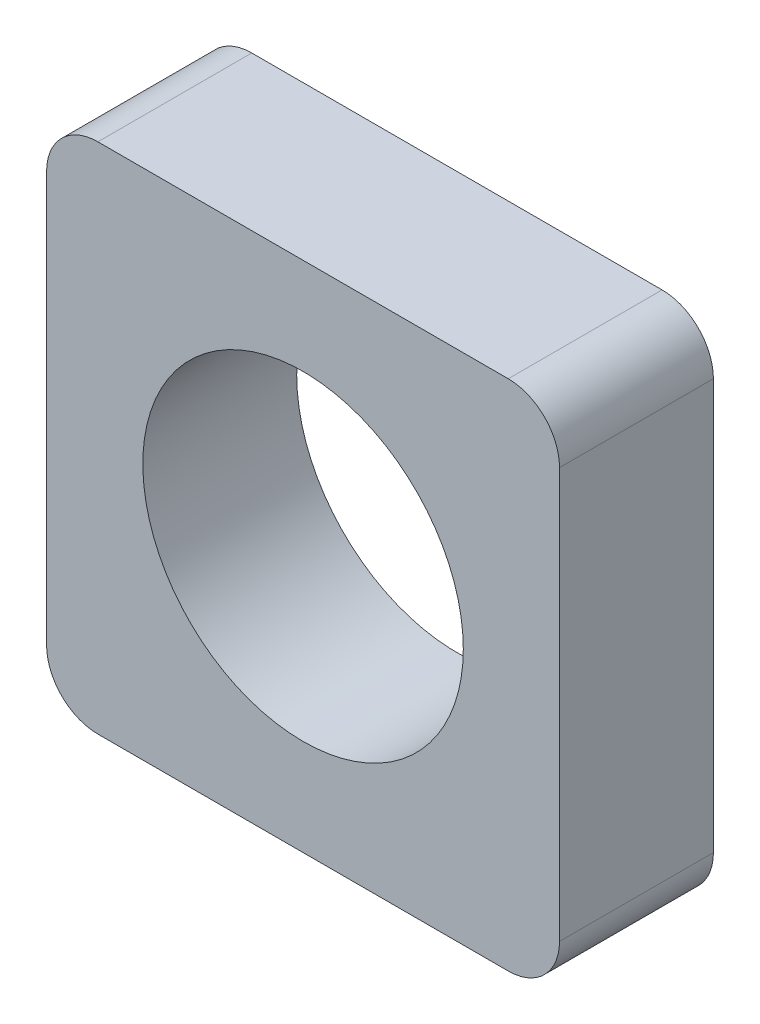
ISO-10303-21;
HEADER;
FILE_DESCRIPTION(('STEP AP214'),'2;1');
FILE_NAME('part.step','',(''),(''),'','','');
FILE_SCHEMA(('AUTOMOTIVE_DESIGN { 1 0 10303 214 1 1 1 1 }'));
ENDSEC;
DATA;
#1=APPLICATION_CONTEXT('core data for automotive mechanical design processes');
#2=APPLICATION_PROTOCOL_DEFINITION('international standard','automotive_design',2000,#1);
#3=PRODUCT_CONTEXT('',#1,'mechanical');
#4=PRODUCT('Part','Part','',(#3));
#5=PRODUCT_RELATED_PRODUCT_CATEGORY('part','',(#4));
#6=PRODUCT_DEFINITION_FORMATION('','',#4);
#7=PRODUCT_DEFINITION_CONTEXT('part definition',#1,'design');
#8=PRODUCT_DEFINITION('design','',#6,#7);
#9=PRODUCT_DEFINITION_SHAPE('','',#8);
#10=(LENGTH_UNIT() NAMED_UNIT(*) SI_UNIT(.MILLI.,.METRE.));
#11=(NAMED_UNIT(*) PLANE_ANGLE_UNIT() SI_UNIT($,.RADIAN.));
#12=(NAMED_UNIT(*) SI_UNIT($,.STERADIAN.) SOLID_ANGLE_UNIT());
#13=UNCERTAINTY_MEASURE_WITH_UNIT(LENGTH_MEASURE(1.E-05),#10,'distance_accuracy_value','');
#14=(GEOMETRIC_REPRESENTATION_CONTEXT(3) GLOBAL_UNCERTAINTY_ASSIGNED_CONTEXT((#13)) GLOBAL_UNIT_ASSIGNED_CONTEXT((#10,
#11,#12)) REPRESENTATION_CONTEXT('',''));
#15=CARTESIAN_POINT('',(0.,0.,0.));
#16=DIRECTION('',(0.,0.,1.));
#17=DIRECTION('',(1.,0.,0.));
#18=AXIS2_PLACEMENT_3D('',#15,#16,#17);
#19=CARTESIAN_POINT('',(-2.54,-2.53999999999999,0.));
#20=DIRECTION('',(0.,0.,-1.));
#21=DIRECTION('',(0.,-1.,0.));
#22=AXIS2_PLACEMENT_3D('',#19,#20,#21);
#23=CYLINDRICAL_SURFACE('',#22,0.635);
#24=CARTESIAN_POINT('',(-2.54,-2.53999999999999,-0.9525));
#25=DIRECTION('',(0.,0.,1.));
#26=DIRECTION('',(1.,0.,0.));
#27=AXIS2_PLACEMENT_3D('',#24,#25,#26);
#28=CIRCLE('',#27,0.635);
#29=CARTESIAN_POINT('',(-3.175,-2.53999999999999,-0.9525));
#30=VERTEX_POINT('',#29);
#31=CARTESIAN_POINT('',(-2.54,-3.17499999999999,-0.9525));
#32=VERTEX_POINT('',#31);
#33=EDGE_CURVE('E10',#30,#32,#28,.T.);
#34=ORIENTED_EDGE('',*,*,#33,.T.);
#35=DIRECTION('',(0.,0.,1.));
#36=VECTOR('',#35,1.);
#37=CARTESIAN_POINT('',(-2.54,-3.17499999999999,0.));
#38=LINE('',#37,#36);
#39=CARTESIAN_POINT('',(-2.54,-3.17499999999999,0.9525));
#40=VERTEX_POINT('',#39);
#41=EDGE_CURVE('E26',#32,#40,#38,.T.);
#42=ORIENTED_EDGE('',*,*,#41,.T.);
#43=CARTESIAN_POINT('',(-2.54,-2.53999999999999,0.9525));
#44=DIRECTION('',(0.,0.,-1.));
#45=DIRECTION('',(0.,-1.,0.));
#46=AXIS2_PLACEMENT_3D('',#43,#44,#45);
#47=CIRCLE('',#46,0.635);
#48=CARTESIAN_POINT('',(-3.175,-2.53999999999999,0.9525));
#49=VERTEX_POINT('',#48);
#50=EDGE_CURVE('E150',#40,#49,#47,.T.);
#51=ORIENTED_EDGE('',*,*,#50,.T.);
#52=DIRECTION('',(0.,0.,-1.));
#53=VECTOR('',#52,1.);
#54=CARTESIAN_POINT('',(-3.175,-2.53999999999999,0.));
#55=LINE('',#54,#53);
#56=EDGE_CURVE('E103',#49,#30,#55,.T.);
#57=ORIENTED_EDGE('',*,*,#56,.T.);
#58=EDGE_LOOP('',(#34,#42,#51,#57));
#59=FACE_BOUND('',#58,.T.);
#60=ADVANCED_FACE('F16',(#59),#23,.T.);
#61=CARTESIAN_POINT('',(3.175,-3.175,0.));
#62=DIRECTION('',(0.,-1.,0.));
#63=DIRECTION('',(1.,0.,0.));
#64=AXIS2_PLACEMENT_3D('',#61,#62,#63);
#65=PLANE('',#64);
#66=ORIENTED_EDGE('',*,*,#41,.F.);
#67=DIRECTION('',(1.,0.,0.));
#68=VECTOR('',#67,1.);
#69=CARTESIAN_POINT('',(3.175,-3.175,-0.9525));
#70=LINE('',#69,#68);
#71=CARTESIAN_POINT('',(2.53999999999999,-3.175,-0.9525));
#72=VERTEX_POINT('',#71);
#73=EDGE_CURVE('E146',#32,#72,#70,.T.);
#74=ORIENTED_EDGE('',*,*,#73,.T.);
#75=DIRECTION('',(0.,0.,-1.));
#76=VECTOR('',#75,1.);
#77=CARTESIAN_POINT('',(2.53999999999999,-3.175,0.));
#78=LINE('',#77,#76);
#79=CARTESIAN_POINT('',(2.53999999999999,-3.175,0.9525));
#80=VERTEX_POINT('',#79);
#81=EDGE_CURVE('E129',#80,#72,#78,.T.);
#82=ORIENTED_EDGE('',*,*,#81,.F.);
#83=DIRECTION('',(-1.,0.,0.));
#84=VECTOR('',#83,1.);
#85=CARTESIAN_POINT('',(3.175,-3.175,0.9525));
#86=LINE('',#85,#84);
#87=EDGE_CURVE('E144',#80,#40,#86,.T.);
#88=ORIENTED_EDGE('',*,*,#87,.T.);
#89=EDGE_LOOP('',(#66,#74,#82,#88));
#90=FACE_BOUND('',#89,.T.);
#91=ADVANCED_FACE('F156',(#90),#65,.T.);
#92=CARTESIAN_POINT('',(0.,0.,-0.9525));
#93=DIRECTION('',(0.,0.,1.));
#94=DIRECTION('',(1.,0.,0.));
#95=AXIS2_PLACEMENT_3D('',#92,#93,#94);
#96=PLANE('',#95);
#97=CARTESIAN_POINT('',(0.,0.,-0.9525));
#98=DIRECTION('',(0.,0.,1.));
#99=DIRECTION('',(1.,0.,0.));
#100=AXIS2_PLACEMENT_3D('',#97,#98,#99);
#101=CIRCLE('',#100,1.98374);
#102=CARTESIAN_POINT('',(1.98374,0.,-0.9525));
#103=VERTEX_POINT('',#102);
#104=EDGE_CURVE('E135',#103,#103,#101,.T.);
#105=ORIENTED_EDGE('',*,*,#104,.T.);
#106=EDGE_LOOP('',(#105));
#107=FACE_BOUND('',#106,.T.);
#108=ORIENTED_EDGE('',*,*,#33,.F.);
#109=DIRECTION('',(0.,-1.,0.));
#110=VECTOR('',#109,1.);
#111=CARTESIAN_POINT('',(-3.175,-3.17499999999999,-0.9525));
#112=LINE('',#111,#110);
#113=CARTESIAN_POINT('',(-3.175,2.54,-0.9525));
#114=VERTEX_POINT('',#113);
#115=EDGE_CURVE('E105',#114,#30,#112,.T.);
#116=ORIENTED_EDGE('',*,*,#115,.F.);
#117=CARTESIAN_POINT('',(-2.54,2.54,-0.9525));
#118=DIRECTION('',(0.,0.,1.));
#119=DIRECTION('',(1.,0.,0.));
#120=AXIS2_PLACEMENT_3D('',#117,#118,#119);
#121=CIRCLE('',#120,0.635);
#122=CARTESIAN_POINT('',(-2.54,3.17499999999999,-0.9525));
#123=VERTEX_POINT('',#122);
#124=EDGE_CURVE('E89',#123,#114,#121,.T.);
#125=ORIENTED_EDGE('',*,*,#124,.F.);
#126=DIRECTION('',(-1.,0.,0.));
#127=VECTOR('',#126,1.);
#128=CARTESIAN_POINT('',(-3.175,3.17499999999999,-0.9525));
#129=LINE('',#128,#127);
#130=CARTESIAN_POINT('',(2.53999999999999,3.175,-0.9525));
#131=VERTEX_POINT('',#130);
#132=EDGE_CURVE('E109',#131,#123,#129,.T.);
#133=ORIENTED_EDGE('',*,*,#132,.F.);
#134=CARTESIAN_POINT('',(2.53999999999999,2.54,-0.9525));
#135=DIRECTION('',(0.,0.,1.));
#136=DIRECTION('',(1.,0.,0.));
#137=AXIS2_PLACEMENT_3D('',#134,#135,#136);
#138=CIRCLE('',#137,0.635);
#139=CARTESIAN_POINT('',(3.175,2.54,-0.9525));
#140=VERTEX_POINT('',#139);
#141=EDGE_CURVE('E118',#140,#131,#138,.T.);
#142=ORIENTED_EDGE('',*,*,#141,.F.);
#143=DIRECTION('',(0.,1.,0.));
#144=VECTOR('',#143,1.);
#145=CARTESIAN_POINT('',(3.175,3.175,-0.9525));
#146=LINE('',#145,#144);
#147=CARTESIAN_POINT('',(3.175,-2.54,-0.9525));
#148=VERTEX_POINT('',#147);
#149=EDGE_CURVE('E122',#148,#140,#146,.T.);
#150=ORIENTED_EDGE('',*,*,#149,.F.);
#151=CARTESIAN_POINT('',(2.53999999999999,-2.54,-0.9525));
#152=DIRECTION('',(0.,0.,1.));
#153=DIRECTION('',(1.,0.,0.));
#154=AXIS2_PLACEMENT_3D('',#151,#152,#153);
#155=CIRCLE('',#154,0.635);
#156=EDGE_CURVE('E132',#72,#148,#155,.T.);
#157=ORIENTED_EDGE('',*,*,#156,.F.);
#158=ORIENTED_EDGE('',*,*,#73,.F.);
#159=EDGE_LOOP('',(#108,#116,#125,#133,#142,#150,#157,#158));
#160=FACE_BOUND('',#159,.T.);
#161=ADVANCED_FACE('F183',(#107,#160),#96,.F.);
#162=CARTESIAN_POINT('',(2.53999999999999,-2.54,0.));
#163=DIRECTION('',(0.,0.,-1.));
#164=DIRECTION('',(0.,-1.,0.));
#165=AXIS2_PLACEMENT_3D('',#162,#163,#164);
#166=CYLINDRICAL_SURFACE('',#165,0.635);
#167=ORIENTED_EDGE('',*,*,#156,.T.);
#168=DIRECTION('',(0.,0.,1.));
#169=VECTOR('',#168,1.);
#170=CARTESIAN_POINT('',(3.17499999999999,-2.54,0.));
#171=LINE('',#170,#169);
#172=CARTESIAN_POINT('',(3.175,-2.54,0.9525));
#173=VERTEX_POINT('',#172);
#174=EDGE_CURVE('E128',#148,#173,#171,.T.);
#175=ORIENTED_EDGE('',*,*,#174,.T.);
#176=CARTESIAN_POINT('',(2.53999999999999,-2.54,0.9525));
#177=DIRECTION('',(0.,0.,-1.));
#178=DIRECTION('',(0.,-1.,0.));
#179=AXIS2_PLACEMENT_3D('',#176,#177,#178);
#180=CIRCLE('',#179,0.635);
#181=EDGE_CURVE('E125',#173,#80,#180,.T.);
#182=ORIENTED_EDGE('',*,*,#181,.T.);
#183=ORIENTED_EDGE('',*,*,#81,.T.);
#184=EDGE_LOOP('',(#167,#175,#182,#183));
#185=FACE_BOUND('',#184,.T.);
#186=ADVANCED_FACE('F159',(#185),#166,.T.);
#187=CARTESIAN_POINT('',(3.17499999999999,0.,0.));
#188=DIRECTION('',(1.,0.,0.));
#189=DIRECTION('',(0.,0.,-1.));
#190=AXIS2_PLACEMENT_3D('',#187,#188,#189);
#191=PLANE('',#190);
#192=ORIENTED_EDGE('',*,*,#174,.F.);
#193=ORIENTED_EDGE('',*,*,#149,.T.);
#194=DIRECTION('',(0.,0.,-1.));
#195=VECTOR('',#194,1.);
#196=CARTESIAN_POINT('',(3.17499999999999,2.54,0.));
#197=LINE('',#196,#195);
#198=CARTESIAN_POINT('',(3.175,2.54,0.9525));
#199=VERTEX_POINT('',#198);
#200=EDGE_CURVE('E115',#199,#140,#197,.T.);
#201=ORIENTED_EDGE('',*,*,#200,.F.);
#202=DIRECTION('',(0.,-1.,0.));
#203=VECTOR('',#202,1.);
#204=CARTESIAN_POINT('',(3.175,3.175,0.9525));
#205=LINE('',#204,#203);
#206=EDGE_CURVE('E119',#199,#173,#205,.T.);
#207=ORIENTED_EDGE('',*,*,#206,.T.);
#208=EDGE_LOOP('',(#192,#193,#201,#207));
#209=FACE_BOUND('',#208,.T.);
#210=ADVANCED_FACE('F163',(#209),#191,.T.);
#211=CARTESIAN_POINT('',(2.53999999999999,2.54,0.));
#212=DIRECTION('',(0.,0.,-1.));
#213=DIRECTION('',(0.,-1.,0.));
#214=AXIS2_PLACEMENT_3D('',#211,#212,#213);
#215=CYLINDRICAL_SURFACE('',#214,0.635);
#216=ORIENTED_EDGE('',*,*,#141,.T.);
#217=DIRECTION('',(0.,0.,1.));
#218=VECTOR('',#217,1.);
#219=CARTESIAN_POINT('',(2.53999999999999,3.175,0.));
#220=LINE('',#219,#218);
#221=CARTESIAN_POINT('',(2.53999999999999,3.175,0.9525));
#222=VERTEX_POINT('',#221);
#223=EDGE_CURVE('E114',#131,#222,#220,.T.);
#224=ORIENTED_EDGE('',*,*,#223,.T.);
#225=CARTESIAN_POINT('',(2.53999999999999,2.54,0.9525));
#226=DIRECTION('',(0.,0.,-1.));
#227=DIRECTION('',(0.,-1.,0.));
#228=AXIS2_PLACEMENT_3D('',#225,#226,#227);
#229=CIRCLE('',#228,0.635);
#230=EDGE_CURVE('E111',#222,#199,#229,.T.);
#231=ORIENTED_EDGE('',*,*,#230,.T.);
#232=ORIENTED_EDGE('',*,*,#200,.T.);
#233=EDGE_LOOP('',(#216,#224,#231,#232));
#234=FACE_BOUND('',#233,.T.);
#235=ADVANCED_FACE('F165',(#234),#215,.T.);
#236=CARTESIAN_POINT('',(0.,3.175,0.));
#237=DIRECTION('',(0.,1.,0.));
#238=DIRECTION('',(-1.,0.,0.));
#239=AXIS2_PLACEMENT_3D('',#236,#237,#238);
#240=PLANE('',#239);
#241=ORIENTED_EDGE('',*,*,#223,.F.);
#242=ORIENTED_EDGE('',*,*,#132,.T.);
#243=DIRECTION('',(0.,0.,-1.));
#244=VECTOR('',#243,1.);
#245=CARTESIAN_POINT('',(-2.54,3.175,0.));
#246=LINE('',#245,#244);
#247=CARTESIAN_POINT('',(-2.54,3.17499999999999,0.9525));
#248=VERTEX_POINT('',#247);
#249=EDGE_CURVE('E78',#248,#123,#246,.T.);
#250=ORIENTED_EDGE('',*,*,#249,.F.);
#251=DIRECTION('',(1.,0.,0.));
#252=VECTOR('',#251,1.);
#253=CARTESIAN_POINT('',(-3.175,3.17499999999999,0.9525));
#254=LINE('',#253,#252);
#255=EDGE_CURVE('E99',#248,#222,#254,.T.);
#256=ORIENTED_EDGE('',*,*,#255,.T.);
#257=EDGE_LOOP('',(#241,#242,#250,#256));
#258=FACE_BOUND('',#257,.T.);
#259=ADVANCED_FACE('F167',(#258),#240,.T.);
#260=CARTESIAN_POINT('',(-2.54,2.54,0.));
#261=DIRECTION('',(0.,0.,1.));
#262=DIRECTION('',(1.,0.,0.));
#263=AXIS2_PLACEMENT_3D('',#260,#261,#262);
#264=CYLINDRICAL_SURFACE('',#263,0.635);
#265=CARTESIAN_POINT('',(-2.54,2.54,0.9525));
#266=DIRECTION('',(0.,0.,-1.));
#267=DIRECTION('',(0.,-1.,0.));
#268=AXIS2_PLACEMENT_3D('',#265,#266,#267);
#269=CIRCLE('',#268,0.635);
#270=CARTESIAN_POINT('',(-3.175,2.54,0.9525));
#271=VERTEX_POINT('',#270);
#272=EDGE_CURVE('E88',#271,#248,#269,.T.);
#273=ORIENTED_EDGE('',*,*,#272,.T.);
#274=ORIENTED_EDGE('',*,*,#249,.T.);
#275=ORIENTED_EDGE('',*,*,#124,.T.);
#276=DIRECTION('',(0.,0.,1.));
#277=VECTOR('',#276,1.);
#278=CARTESIAN_POINT('',(-3.175,2.54,0.));
#279=LINE('',#278,#277);
#280=EDGE_CURVE('E85',#114,#271,#279,.T.);
#281=ORIENTED_EDGE('',*,*,#280,.T.);
#282=EDGE_LOOP('',(#273,#274,#275,#281));
#283=FACE_BOUND('',#282,.T.);
#284=ADVANCED_FACE('F87',(#283),#264,.T.);
#285=CARTESIAN_POINT('',(-3.175,-3.17499999999999,0.));
#286=DIRECTION('',(-1.,0.,0.));
#287=DIRECTION('',(0.,0.,1.));
#288=AXIS2_PLACEMENT_3D('',#285,#286,#287);
#289=PLANE('',#288);
#290=ORIENTED_EDGE('',*,*,#56,.F.);
#291=DIRECTION('',(0.,1.,0.));
#292=VECTOR('',#291,1.);
#293=CARTESIAN_POINT('',(-3.175,-3.17499999999999,0.9525));
#294=LINE('',#293,#292);
#295=EDGE_CURVE('E93',#49,#271,#294,.T.);
#296=ORIENTED_EDGE('',*,*,#295,.T.);
#297=ORIENTED_EDGE('',*,*,#280,.F.);
#298=ORIENTED_EDGE('',*,*,#115,.T.);
#299=EDGE_LOOP('',(#290,#296,#297,#298));
#300=FACE_BOUND('',#299,.T.);
#301=ADVANCED_FACE('F101',(#300),#289,.T.);
#302=CARTESIAN_POINT('',(0.,0.,0.));
#303=DIRECTION('',(0.,0.,1.));
#304=DIRECTION('',(1.,0.,0.));
#305=AXIS2_PLACEMENT_3D('',#302,#303,#304);
#306=CYLINDRICAL_SURFACE('',#305,1.98374);
#307=ORIENTED_EDGE('',*,*,#104,.F.);
#308=EDGE_LOOP('',(#307));
#309=FACE_BOUND('',#308,.T.);
#310=CARTESIAN_POINT('',(0.,0.,0.9525));
#311=DIRECTION('',(0.,0.,-1.));
#312=DIRECTION('',(0.,-1.,0.));
#313=AXIS2_PLACEMENT_3D('',#310,#311,#312);
#314=CIRCLE('',#313,1.98374);
#315=CARTESIAN_POINT('',(0.,-1.98374,0.9525));
#316=VERTEX_POINT('',#315);
#317=EDGE_CURVE('E20',#316,#316,#314,.T.);
#318=ORIENTED_EDGE('',*,*,#317,.F.);
#319=EDGE_LOOP('',(#318));
#320=FACE_BOUND('',#319,.T.);
#321=ADVANCED_FACE('F18',(#309,#320),#306,.F.);
#322=CARTESIAN_POINT('',(0.,0.,0.9525));
#323=DIRECTION('',(0.,0.,1.));
#324=DIRECTION('',(1.,0.,0.));
#325=AXIS2_PLACEMENT_3D('',#322,#323,#324);
#326=PLANE('',#325);
#327=ORIENTED_EDGE('',*,*,#50,.F.);
#328=ORIENTED_EDGE('',*,*,#87,.F.);
#329=ORIENTED_EDGE('',*,*,#181,.F.);
#330=ORIENTED_EDGE('',*,*,#206,.F.);
#331=ORIENTED_EDGE('',*,*,#230,.F.);
#332=ORIENTED_EDGE('',*,*,#255,.F.);
#333=ORIENTED_EDGE('',*,*,#272,.F.);
#334=ORIENTED_EDGE('',*,*,#295,.F.);
#335=EDGE_LOOP('',(#327,#328,#329,#330,#331,#332,#333,#334));
#336=FACE_BOUND('',#335,.T.);
#337=ORIENTED_EDGE('',*,*,#317,.T.);
#338=EDGE_LOOP('',(#337));
#339=FACE_BOUND('',#338,.T.);
#340=ADVANCED_FACE('F97',(#336,#339),#326,.T.);
#341=CLOSED_SHELL('',(#60,#91,#161,#186,#210,#235,#259,#284,#301,#321,#340));
#342=MANIFOLD_SOLID_BREP('B1',#341);
#343=ADVANCED_BREP_SHAPE_REPRESENTATION('',(#18,#342),#14);
#344=SHAPE_DEFINITION_REPRESENTATION(#9,#343);
ENDSEC;
END-ISO-10303-21;
